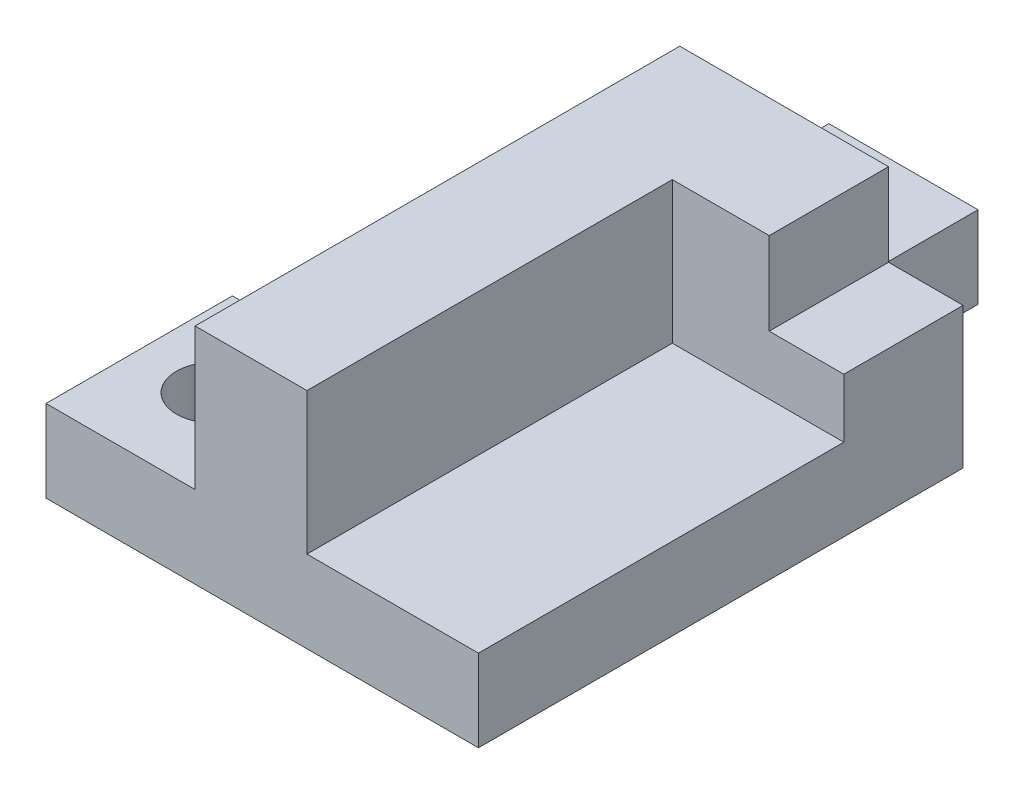
ISO-10303-21;
HEADER;
FILE_DESCRIPTION(('STEP AP214'),'2;1');
FILE_NAME('part.step','',(''),(''),'','','');
FILE_SCHEMA(('AUTOMOTIVE_DESIGN { 1 0 10303 214 1 1 1 1 }'));
ENDSEC;
DATA;
#1=APPLICATION_CONTEXT('core data for automotive mechanical design processes');
#2=APPLICATION_PROTOCOL_DEFINITION('international standard','automotive_design',2000,#1);
#3=PRODUCT_CONTEXT('',#1,'mechanical');
#4=PRODUCT('Part','Part','',(#3));
#5=PRODUCT_RELATED_PRODUCT_CATEGORY('part','',(#4));
#6=PRODUCT_DEFINITION_FORMATION('','',#4);
#7=PRODUCT_DEFINITION_CONTEXT('part definition',#1,'design');
#8=PRODUCT_DEFINITION('design','',#6,#7);
#9=PRODUCT_DEFINITION_SHAPE('','',#8);
#10=(LENGTH_UNIT() NAMED_UNIT(*) SI_UNIT(.MILLI.,.METRE.));
#11=(NAMED_UNIT(*) PLANE_ANGLE_UNIT() SI_UNIT($,.RADIAN.));
#12=(NAMED_UNIT(*) SI_UNIT($,.STERADIAN.) SOLID_ANGLE_UNIT());
#13=UNCERTAINTY_MEASURE_WITH_UNIT(LENGTH_MEASURE(1.E-05),#10,'distance_accuracy_value','');
#14=(GEOMETRIC_REPRESENTATION_CONTEXT(3) GLOBAL_UNCERTAINTY_ASSIGNED_CONTEXT((#13)) GLOBAL_UNIT_ASSIGNED_CONTEXT((#10,
#11,#12)) REPRESENTATION_CONTEXT('',''));
#15=CARTESIAN_POINT('',(0.,0.,0.));
#16=DIRECTION('',(0.,0.,1.));
#17=DIRECTION('',(1.,0.,0.));
#18=AXIS2_PLACEMENT_3D('',#15,#16,#17);
#19=CARTESIAN_POINT('',(-184.5,20.,-100.));
#20=DIRECTION('',(0.,0.,1.));
#21=DIRECTION('',(1.,0.,0.));
#22=AXIS2_PLACEMENT_3D('',#19,#20,#21);
#23=PLANE('',#22);
#24=DIRECTION('',(0.,-1.,0.));
#25=VECTOR('',#24,1.);
#26=CARTESIAN_POINT('',(-164.5,11.,-100.));
#27=LINE('',#26,#25);
#28=CARTESIAN_POINT('',(-164.5,11.,-100.));
#29=VERTEX_POINT('',#28);
#30=CARTESIAN_POINT('',(-164.5,0.,-100.));
#31=VERTEX_POINT('',#30);
#32=EDGE_CURVE('E164',#29,#31,#27,.T.);
#33=ORIENTED_EDGE('',*,*,#32,.F.);
#34=DIRECTION('',(1.,0.,0.));
#35=VECTOR('',#34,1.);
#36=CARTESIAN_POINT('',(-184.5,11.,-100.));
#37=LINE('',#36,#35);
#38=CARTESIAN_POINT('',(-184.5,11.,-100.));
#39=VERTEX_POINT('',#38);
#40=EDGE_CURVE('E54',#39,#29,#37,.T.);
#41=ORIENTED_EDGE('',*,*,#40,.F.);
#42=DIRECTION('',(0.,-1.,0.));
#43=VECTOR('',#42,1.);
#44=CARTESIAN_POINT('',(-184.5,20.,-100.));
#45=LINE('',#44,#43);
#46=CARTESIAN_POINT('',(-184.5,30.,-100.));
#47=VERTEX_POINT('',#46);
#48=EDGE_CURVE('E169',#47,#39,#45,.T.);
#49=ORIENTED_EDGE('',*,*,#48,.F.);
#50=DIRECTION('',(-1.,0.,0.));
#51=VECTOR('',#50,1.);
#52=CARTESIAN_POINT('',(-169.5,30.,-100.));
#53=LINE('',#52,#51);
#54=CARTESIAN_POINT('',(-156.5,30.,-100.));
#55=VERTEX_POINT('',#54);
#56=EDGE_CURVE('E238',#55,#47,#53,.T.);
#57=ORIENTED_EDGE('',*,*,#56,.F.);
#58=DIRECTION('',(0.,-1.,0.));
#59=VECTOR('',#58,1.);
#60=CARTESIAN_POINT('',(-156.5,20.,-100.));
#61=LINE('',#60,#59);
#62=CARTESIAN_POINT('',(-156.5,18.8949525573648,-100.));
#63=VERTEX_POINT('',#62);
#64=EDGE_CURVE('E213',#55,#63,#61,.T.);
#65=ORIENTED_EDGE('',*,*,#64,.T.);
#66=DIRECTION('',(1.,0.,0.));
#67=VECTOR('',#66,1.);
#68=CARTESIAN_POINT('',(-184.5,18.8949525573648,-100.));
#69=LINE('',#68,#67);
#70=CARTESIAN_POINT('',(-146.5,18.8949525573648,-100.));
#71=VERTEX_POINT('',#70);
#72=EDGE_CURVE('E207',#63,#71,#69,.T.);
#73=ORIENTED_EDGE('',*,*,#72,.T.);
#74=DIRECTION('',(0.,-1.,0.));
#75=VECTOR('',#74,1.);
#76=CARTESIAN_POINT('',(-146.5,20.,-100.));
#77=LINE('',#76,#75);
#78=CARTESIAN_POINT('',(-146.5,0.,-100.));
#79=VERTEX_POINT('',#78);
#80=EDGE_CURVE('E224',#71,#79,#77,.T.);
#81=ORIENTED_EDGE('',*,*,#80,.T.);
#82=DIRECTION('',(-1.,0.,0.));
#83=VECTOR('',#82,1.);
#84=CARTESIAN_POINT('',(-184.5,0.,-100.));
#85=LINE('',#84,#83);
#86=EDGE_CURVE('E60',#79,#31,#85,.T.);
#87=ORIENTED_EDGE('',*,*,#86,.T.);
#88=EDGE_LOOP('',(#33,#41,#49,#57,#65,#73,#81,#87));
#89=FACE_BOUND('',#88,.T.);
#90=ADVANCED_FACE('F39',(#89),#23,.F.);
#91=CARTESIAN_POINT('',(-184.5,20.,100.));
#92=DIRECTION('',(1.,0.,0.));
#93=DIRECTION('',(0.,0.,-1.));
#94=AXIS2_PLACEMENT_3D('',#91,#92,#93);
#95=PLANE('',#94);
#96=DIRECTION('',(0.,-1.,0.));
#97=VECTOR('',#96,1.);
#98=CARTESIAN_POINT('',(-184.5,0.,-60.));
#99=LINE('',#98,#97);
#100=CARTESIAN_POINT('',(-184.5,11.,-60.));
#101=VERTEX_POINT('',#100);
#102=CARTESIAN_POINT('',(-184.5,0.,-60.));
#103=VERTEX_POINT('',#102);
#104=EDGE_CURVE('E170',#101,#103,#99,.T.);
#105=ORIENTED_EDGE('',*,*,#104,.F.);
#106=DIRECTION('',(0.,0.,-1.));
#107=VECTOR('',#106,1.);
#108=CARTESIAN_POINT('',(-184.5,11.,0.));
#109=LINE('',#108,#107);
#110=CARTESIAN_POINT('',(-184.5,11.,-35.));
#111=VERTEX_POINT('',#110);
#112=EDGE_CURVE('E197',#111,#101,#109,.T.);
#113=ORIENTED_EDGE('',*,*,#112,.F.);
#114=DIRECTION('',(0.,-1.,0.));
#115=VECTOR('',#114,1.);
#116=CARTESIAN_POINT('',(-184.5,30.,-35.));
#117=LINE('',#116,#115);
#118=CARTESIAN_POINT('',(-184.5,30.,-35.));
#119=VERTEX_POINT('',#118);
#120=EDGE_CURVE('E231',#119,#111,#117,.T.);
#121=ORIENTED_EDGE('',*,*,#120,.F.);
#122=DIRECTION('',(0.,0.,1.));
#123=VECTOR('',#122,1.);
#124=CARTESIAN_POINT('',(-184.5,30.,-100.));
#125=LINE('',#124,#123);
#126=EDGE_CURVE('E247',#47,#119,#125,.T.);
#127=ORIENTED_EDGE('',*,*,#126,.F.);
#128=ORIENTED_EDGE('',*,*,#48,.T.);
#129=DIRECTION('',(0.,0.,1.));
#130=VECTOR('',#129,1.);
#131=CARTESIAN_POINT('',(-184.5,11.,-120.));
#132=LINE('',#131,#130);
#133=CARTESIAN_POINT('',(-184.5,11.,-120.));
#134=VERTEX_POINT('',#133);
#135=EDGE_CURVE('E150',#134,#39,#132,.T.);
#136=ORIENTED_EDGE('',*,*,#135,.F.);
#137=DIRECTION('',(0.,1.,0.));
#138=VECTOR('',#137,1.);
#139=CARTESIAN_POINT('',(-184.5,0.,-120.));
#140=LINE('',#139,#138);
#141=CARTESIAN_POINT('',(-184.5,0.,-120.));
#142=VERTEX_POINT('',#141);
#143=EDGE_CURVE('E156',#142,#134,#140,.T.);
#144=ORIENTED_EDGE('',*,*,#143,.F.);
#145=DIRECTION('',(0.,0.,1.));
#146=VECTOR('',#145,1.);
#147=CARTESIAN_POINT('',(-184.5,0.,100.));
#148=LINE('',#147,#146);
#149=EDGE_CURVE('E251',#142,#103,#148,.T.);
#150=ORIENTED_EDGE('',*,*,#149,.T.);
#151=EDGE_LOOP('',(#105,#113,#121,#127,#128,#136,#144,#150));
#152=FACE_BOUND('',#151,.T.);
#153=ADVANCED_FACE('F167',(#152),#95,.F.);
#154=CARTESIAN_POINT('',(-156.5,53.6124200983763,100.));
#155=DIRECTION('',(-1.,0.,0.));
#156=DIRECTION('',(0.,0.,1.));
#157=AXIS2_PLACEMENT_3D('',#154,#155,#156);
#158=PLANE('',#157);
#159=DIRECTION('',(0.,0.,-1.));
#160=VECTOR('',#159,1.);
#161=CARTESIAN_POINT('',(-156.5,18.8949525573648,100.));
#162=LINE('',#161,#160);
#163=CARTESIAN_POINT('',(-156.5,18.8949525573648,-84.));
#164=VERTEX_POINT('',#163);
#165=EDGE_CURVE('E203',#164,#63,#162,.T.);
#166=ORIENTED_EDGE('',*,*,#165,.T.);
#167=ORIENTED_EDGE('',*,*,#64,.F.);
#168=DIRECTION('',(0.,0.,1.));
#169=VECTOR('',#168,1.);
#170=CARTESIAN_POINT('',(-156.5,30.,0.));
#171=LINE('',#170,#169);
#172=CARTESIAN_POINT('',(-156.5,30.,-84.));
#173=VERTEX_POINT('',#172);
#174=EDGE_CURVE('E47',#55,#173,#171,.T.);
#175=ORIENTED_EDGE('',*,*,#174,.T.);
#176=DIRECTION('',(0.,1.,0.));
#177=VECTOR('',#176,1.);
#178=CARTESIAN_POINT('',(-156.5,30.,-84.));
#179=LINE('',#178,#177);
#180=EDGE_CURVE('E216',#164,#173,#179,.T.);
#181=ORIENTED_EDGE('',*,*,#180,.F.);
#182=EDGE_LOOP('',(#166,#167,#175,#181));
#183=FACE_BOUND('',#182,.T.);
#184=ADVANCED_FACE('F262',(#183),#158,.F.);
#185=CARTESIAN_POINT('',(0.,30.,0.));
#186=DIRECTION('',(0.,1.,0.));
#187=DIRECTION('',(0.,0.,1.));
#188=AXIS2_PLACEMENT_3D('',#185,#186,#187);
#189=PLANE('',#188);
#190=ORIENTED_EDGE('',*,*,#174,.F.);
#191=ORIENTED_EDGE('',*,*,#56,.T.);
#192=ORIENTED_EDGE('',*,*,#126,.T.);
#193=DIRECTION('',(1.,0.,0.));
#194=VECTOR('',#193,1.);
#195=CARTESIAN_POINT('',(-184.5,30.,-35.));
#196=LINE('',#195,#194);
#197=CARTESIAN_POINT('',(-169.5,30.,-35.));
#198=VERTEX_POINT('',#197);
#199=EDGE_CURVE('E245',#119,#198,#196,.T.);
#200=ORIENTED_EDGE('',*,*,#199,.T.);
#201=DIRECTION('',(0.,0.,-1.));
#202=VECTOR('',#201,1.);
#203=CARTESIAN_POINT('',(-169.5,30.,-84.));
#204=LINE('',#203,#202);
#205=CARTESIAN_POINT('',(-169.5,30.,-84.));
#206=VERTEX_POINT('',#205);
#207=EDGE_CURVE('E243',#198,#206,#204,.T.);
#208=ORIENTED_EDGE('',*,*,#207,.T.);
#209=DIRECTION('',(1.,0.,0.));
#210=VECTOR('',#209,1.);
#211=CARTESIAN_POINT('',(-169.5,30.,-84.));
#212=LINE('',#211,#210);
#213=EDGE_CURVE('E240',#206,#173,#212,.T.);
#214=ORIENTED_EDGE('',*,*,#213,.T.);
#215=EDGE_LOOP('',(#190,#191,#192,#200,#208,#214));
#216=FACE_BOUND('',#215,.T.);
#217=ADVANCED_FACE('F269',(#216),#189,.T.);
#218=CARTESIAN_POINT('',(-169.5,30.,-84.));
#219=DIRECTION('',(0.,0.,-1.));
#220=DIRECTION('',(-1.,0.,0.));
#221=AXIS2_PLACEMENT_3D('',#218,#219,#220);
#222=PLANE('',#221);
#223=DIRECTION('',(-1.,0.,0.));
#224=VECTOR('',#223,1.);
#225=CARTESIAN_POINT('',(-169.5,18.8949525573648,-84.));
#226=LINE('',#225,#224);
#227=CARTESIAN_POINT('',(-146.5,18.8949525573648,-84.));
#228=VERTEX_POINT('',#227);
#229=EDGE_CURVE('E210',#228,#164,#226,.T.);
#230=ORIENTED_EDGE('',*,*,#229,.T.);
#231=ORIENTED_EDGE('',*,*,#180,.T.);
#232=ORIENTED_EDGE('',*,*,#213,.F.);
#233=DIRECTION('',(0.,-1.,0.));
#234=VECTOR('',#233,1.);
#235=CARTESIAN_POINT('',(-169.5,30.,-84.));
#236=LINE('',#235,#234);
#237=CARTESIAN_POINT('',(-169.5,11.,-84.));
#238=VERTEX_POINT('',#237);
#239=EDGE_CURVE('E235',#206,#238,#236,.T.);
#240=ORIENTED_EDGE('',*,*,#239,.T.);
#241=DIRECTION('',(-1.,0.,0.));
#242=VECTOR('',#241,1.);
#243=CARTESIAN_POINT('',(-169.5,11.,-84.));
#244=LINE('',#243,#242);
#245=CARTESIAN_POINT('',(-146.5,11.,-84.));
#246=VERTEX_POINT('',#245);
#247=EDGE_CURVE('E229',#246,#238,#244,.T.);
#248=ORIENTED_EDGE('',*,*,#247,.F.);
#249=DIRECTION('',(0.,1.,0.));
#250=VECTOR('',#249,1.);
#251=CARTESIAN_POINT('',(-146.5,30.,-84.));
#252=LINE('',#251,#250);
#253=EDGE_CURVE('E219',#246,#228,#252,.T.);
#254=ORIENTED_EDGE('',*,*,#253,.T.);
#255=EDGE_LOOP('',(#230,#231,#232,#240,#248,#254));
#256=FACE_BOUND('',#255,.T.);
#257=ADVANCED_FACE('F268',(#256),#222,.F.);
#258=CARTESIAN_POINT('',(-119.5,18.8949525573648,100.));
#259=DIRECTION('',(0.,-1.,0.));
#260=DIRECTION('',(0.,0.,-1.));
#261=AXIS2_PLACEMENT_3D('',#258,#259,#260);
#262=PLANE('',#261);
#263=DIRECTION('',(0.,0.,1.));
#264=VECTOR('',#263,1.);
#265=CARTESIAN_POINT('',(-146.5,18.8949525573648,-161.504576805052));
#266=LINE('',#265,#264);
#267=EDGE_CURVE('E257',#71,#228,#266,.T.);
#268=ORIENTED_EDGE('',*,*,#267,.F.);
#269=ORIENTED_EDGE('',*,*,#72,.F.);
#270=ORIENTED_EDGE('',*,*,#165,.F.);
#271=ORIENTED_EDGE('',*,*,#229,.F.);
#272=EDGE_LOOP('',(#268,#269,#270,#271));
#273=FACE_BOUND('',#272,.T.);
#274=ADVANCED_FACE('F287',(#273),#262,.F.);
#275=CARTESIAN_POINT('',(-146.5,-39.,-161.504576805052));
#276=DIRECTION('',(-1.,0.,0.));
#277=DIRECTION('',(0.,0.,1.));
#278=AXIS2_PLACEMENT_3D('',#275,#276,#277);
#279=PLANE('',#278);
#280=DIRECTION('',(0.,0.,1.));
#281=VECTOR('',#280,1.);
#282=CARTESIAN_POINT('',(-146.5,11.,0.));
#283=LINE('',#282,#281);
#284=CARTESIAN_POINT('',(-146.5,11.,-35.));
#285=VERTEX_POINT('',#284);
#286=EDGE_CURVE('E254',#246,#285,#283,.T.);
#287=ORIENTED_EDGE('',*,*,#286,.T.);
#288=DIRECTION('',(0.,1.,0.));
#289=VECTOR('',#288,1.);
#290=CARTESIAN_POINT('',(-146.5,-190.,-35.));
#291=LINE('',#290,#289);
#292=CARTESIAN_POINT('',(-146.5,0.,-35.));
#293=VERTEX_POINT('',#292);
#294=EDGE_CURVE('E187',#293,#285,#291,.T.);
#295=ORIENTED_EDGE('',*,*,#294,.F.);
#296=DIRECTION('',(0.,0.,-1.));
#297=VECTOR('',#296,1.);
#298=CARTESIAN_POINT('',(-146.5,0.,0.));
#299=LINE('',#298,#297);
#300=EDGE_CURVE('E222',#293,#79,#299,.T.);
#301=ORIENTED_EDGE('',*,*,#300,.T.);
#302=ORIENTED_EDGE('',*,*,#80,.F.);
#303=ORIENTED_EDGE('',*,*,#267,.T.);
#304=ORIENTED_EDGE('',*,*,#253,.F.);
#305=EDGE_LOOP('',(#287,#295,#301,#302,#303,#304));
#306=FACE_BOUND('',#305,.T.);
#307=ADVANCED_FACE('F283',(#306),#279,.F.);
#308=CARTESIAN_POINT('',(0.,11.,0.));
#309=DIRECTION('',(0.,1.,0.));
#310=DIRECTION('',(0.,0.,1.));
#311=AXIS2_PLACEMENT_3D('',#308,#309,#310);
#312=PLANE('',#311);
#313=DIRECTION('',(-1.,0.,0.));
#314=VECTOR('',#313,1.);
#315=CARTESIAN_POINT('',(0.,11.,-35.));
#316=LINE('',#315,#314);
#317=CARTESIAN_POINT('',(-169.5,11.,-35.));
#318=VERTEX_POINT('',#317);
#319=EDGE_CURVE('E192',#285,#318,#316,.T.);
#320=ORIENTED_EDGE('',*,*,#319,.F.);
#321=ORIENTED_EDGE('',*,*,#286,.F.);
#322=ORIENTED_EDGE('',*,*,#247,.T.);
#323=DIRECTION('',(0.,0.,1.));
#324=VECTOR('',#323,1.);
#325=CARTESIAN_POINT('',(-169.5,11.,-84.));
#326=LINE('',#325,#324);
#327=EDGE_CURVE('E226',#238,#318,#326,.T.);
#328=ORIENTED_EDGE('',*,*,#327,.T.);
#329=EDGE_LOOP('',(#320,#321,#322,#328));
#330=FACE_BOUND('',#329,.T.);
#331=ADVANCED_FACE('F280',(#330),#312,.T.);
#332=CARTESIAN_POINT('',(-169.5,30.,84.));
#333=DIRECTION('',(-1.,0.,0.));
#334=DIRECTION('',(0.,0.,1.));
#335=AXIS2_PLACEMENT_3D('',#332,#333,#334);
#336=PLANE('',#335);
#337=DIRECTION('',(0.,-1.,0.));
#338=VECTOR('',#337,1.);
#339=CARTESIAN_POINT('',(-169.5,30.,-35.));
#340=LINE('',#339,#338);
#341=EDGE_CURVE('E233',#198,#318,#340,.T.);
#342=ORIENTED_EDGE('',*,*,#341,.T.);
#343=ORIENTED_EDGE('',*,*,#327,.F.);
#344=ORIENTED_EDGE('',*,*,#239,.F.);
#345=ORIENTED_EDGE('',*,*,#207,.F.);
#346=EDGE_LOOP('',(#342,#343,#344,#345));
#347=FACE_BOUND('',#346,.T.);
#348=ADVANCED_FACE('F275',(#347),#336,.F.);
#349=CARTESIAN_POINT('',(-204.5,0.,0.));
#350=DIRECTION('',(-1.,0.,0.));
#351=DIRECTION('',(0.,0.,1.));
#352=AXIS2_PLACEMENT_3D('',#349,#350,#351);
#353=PLANE('',#352);
#354=DIRECTION('',(0.,-1.,0.));
#355=VECTOR('',#354,1.);
#356=CARTESIAN_POINT('',(-204.5,0.,-35.));
#357=LINE('',#356,#355);
#358=CARTESIAN_POINT('',(-204.5,11.,-35.));
#359=VERTEX_POINT('',#358);
#360=CARTESIAN_POINT('',(-204.5,0.,-35.));
#361=VERTEX_POINT('',#360);
#362=EDGE_CURVE('E11',#359,#361,#357,.T.);
#363=ORIENTED_EDGE('',*,*,#362,.F.);
#364=DIRECTION('',(0.,0.,-1.));
#365=VECTOR('',#364,1.);
#366=CARTESIAN_POINT('',(-204.5,11.,0.));
#367=LINE('',#366,#365);
#368=CARTESIAN_POINT('',(-204.5,11.,-60.));
#369=VERTEX_POINT('',#368);
#370=EDGE_CURVE('E198',#359,#369,#367,.T.);
#371=ORIENTED_EDGE('',*,*,#370,.T.);
#372=DIRECTION('',(0.,1.,0.));
#373=VECTOR('',#372,1.);
#374=CARTESIAN_POINT('',(-204.5,11.,-60.));
#375=LINE('',#374,#373);
#376=CARTESIAN_POINT('',(-204.5,0.,-60.));
#377=VERTEX_POINT('',#376);
#378=EDGE_CURVE('E181',#377,#369,#375,.T.);
#379=ORIENTED_EDGE('',*,*,#378,.F.);
#380=DIRECTION('',(0.,0.,1.));
#381=VECTOR('',#380,1.);
#382=CARTESIAN_POINT('',(-204.5,0.,0.));
#383=LINE('',#382,#381);
#384=EDGE_CURVE('E200',#377,#361,#383,.T.);
#385=ORIENTED_EDGE('',*,*,#384,.T.);
#386=EDGE_LOOP('',(#363,#371,#379,#385));
#387=FACE_BOUND('',#386,.T.);
#388=ADVANCED_FACE('F299',(#387),#353,.T.);
#389=CARTESIAN_POINT('',(-204.5,11.,0.));
#390=DIRECTION('',(0.,-1.,0.));
#391=DIRECTION('',(0.,0.,-1.));
#392=AXIS2_PLACEMENT_3D('',#389,#390,#391);
#393=PLANE('',#392);
#394=CARTESIAN_POINT('',(-194.5,11.,-47.5));
#395=DIRECTION('',(0.,1.,0.));
#396=DIRECTION('',(0.,0.,1.));
#397=AXIS2_PLACEMENT_3D('',#394,#395,#396);
#398=CIRCLE('',#397,4.99999999999999);
#399=CARTESIAN_POINT('',(-194.5,11.,-42.5));
#400=VERTEX_POINT('',#399);
#401=EDGE_CURVE('E317',#400,#400,#398,.T.);
#402=ORIENTED_EDGE('',*,*,#401,.F.);
#403=EDGE_LOOP('',(#402));
#404=FACE_BOUND('',#403,.T.);
#405=ORIENTED_EDGE('',*,*,#370,.F.);
#406=DIRECTION('',(1.,0.,0.));
#407=VECTOR('',#406,1.);
#408=CARTESIAN_POINT('',(-204.5,11.,-35.));
#409=LINE('',#408,#407);
#410=EDGE_CURVE('E189',#359,#111,#409,.T.);
#411=ORIENTED_EDGE('',*,*,#410,.T.);
#412=ORIENTED_EDGE('',*,*,#112,.T.);
#413=DIRECTION('',(1.,0.,0.));
#414=VECTOR('',#413,1.);
#415=CARTESIAN_POINT('',(-184.5,11.,-60.));
#416=LINE('',#415,#414);
#417=EDGE_CURVE('E184',#369,#101,#416,.T.);
#418=ORIENTED_EDGE('',*,*,#417,.F.);
#419=EDGE_LOOP('',(#405,#411,#412,#418));
#420=FACE_BOUND('',#419,.T.);
#421=ADVANCED_FACE('F295',(#404,#420),#393,.F.);
#422=CARTESIAN_POINT('',(0.,0.,0.));
#423=DIRECTION('',(0.,-1.,0.));
#424=DIRECTION('',(0.,0.,-1.));
#425=AXIS2_PLACEMENT_3D('',#422,#423,#424);
#426=PLANE('',#425);
#427=CARTESIAN_POINT('',(-174.5,0.,-110.));
#428=DIRECTION('',(0.,-1.,0.));
#429=DIRECTION('',(0.,0.,-1.));
#430=AXIS2_PLACEMENT_3D('',#427,#428,#429);
#431=CIRCLE('',#430,5.00000000000002);
#432=CARTESIAN_POINT('',(-174.5,0.,-115.));
#433=VERTEX_POINT('',#432);
#434=EDGE_CURVE('E314',#433,#433,#431,.T.);
#435=ORIENTED_EDGE('',*,*,#434,.F.);
#436=EDGE_LOOP('',(#435));
#437=FACE_BOUND('',#436,.T.);
#438=CARTESIAN_POINT('',(-194.5,0.,-47.5));
#439=DIRECTION('',(0.,-1.,0.));
#440=DIRECTION('',(0.,0.,-1.));
#441=AXIS2_PLACEMENT_3D('',#438,#439,#440);
#442=CIRCLE('',#441,4.99999999999999);
#443=CARTESIAN_POINT('',(-194.5,0.,-52.5));
#444=VERTEX_POINT('',#443);
#445=EDGE_CURVE('E42',#444,#444,#442,.T.);
#446=ORIENTED_EDGE('',*,*,#445,.F.);
#447=EDGE_LOOP('',(#446));
#448=FACE_BOUND('',#447,.T.);
#449=DIRECTION('',(1.,0.,0.));
#450=VECTOR('',#449,1.);
#451=CARTESIAN_POINT('',(0.,0.,-35.));
#452=LINE('',#451,#450);
#453=EDGE_CURVE('E195',#361,#293,#452,.T.);
#454=ORIENTED_EDGE('',*,*,#453,.F.);
#455=ORIENTED_EDGE('',*,*,#384,.F.);
#456=DIRECTION('',(-1.,0.,0.));
#457=VECTOR('',#456,1.);
#458=CARTESIAN_POINT('',(-204.5,0.,-60.));
#459=LINE('',#458,#457);
#460=EDGE_CURVE('E173',#103,#377,#459,.T.);
#461=ORIENTED_EDGE('',*,*,#460,.F.);
#462=ORIENTED_EDGE('',*,*,#149,.F.);
#463=DIRECTION('',(-1.,0.,0.));
#464=VECTOR('',#463,1.);
#465=CARTESIAN_POINT('',(-164.5,0.,-120.));
#466=LINE('',#465,#464);
#467=CARTESIAN_POINT('',(-164.5,0.,-120.));
#468=VERTEX_POINT('',#467);
#469=EDGE_CURVE('E162',#468,#142,#466,.T.);
#470=ORIENTED_EDGE('',*,*,#469,.F.);
#471=DIRECTION('',(0.,0.,1.));
#472=VECTOR('',#471,1.);
#473=CARTESIAN_POINT('',(-164.5,0.,-120.));
#474=LINE('',#473,#472);
#475=EDGE_CURVE('E175',#468,#31,#474,.T.);
#476=ORIENTED_EDGE('',*,*,#475,.T.);
#477=ORIENTED_EDGE('',*,*,#86,.F.);
#478=ORIENTED_EDGE('',*,*,#300,.F.);
#479=EDGE_LOOP('',(#454,#455,#461,#462,#470,#476,#477,#478));
#480=FACE_BOUND('',#479,.T.);
#481=ADVANCED_FACE('F305',(#437,#448,#480),#426,.T.);
#482=CARTESIAN_POINT('',(-184.5,30.,-35.));
#483=DIRECTION('',(0.,0.,-1.));
#484=DIRECTION('',(-1.,0.,0.));
#485=AXIS2_PLACEMENT_3D('',#482,#483,#484);
#486=PLANE('',#485);
#487=ORIENTED_EDGE('',*,*,#120,.T.);
#488=ORIENTED_EDGE('',*,*,#410,.F.);
#489=ORIENTED_EDGE('',*,*,#362,.T.);
#490=ORIENTED_EDGE('',*,*,#453,.T.);
#491=ORIENTED_EDGE('',*,*,#294,.T.);
#492=ORIENTED_EDGE('',*,*,#319,.T.);
#493=ORIENTED_EDGE('',*,*,#341,.F.);
#494=ORIENTED_EDGE('',*,*,#199,.F.);
#495=EDGE_LOOP('',(#487,#488,#489,#490,#491,#492,#493,#494));
#496=FACE_BOUND('',#495,.T.);
#497=ADVANCED_FACE('F291',(#496),#486,.F.);
#498=CARTESIAN_POINT('',(0.,0.,-60.));
#499=DIRECTION('',(0.,0.,1.));
#500=DIRECTION('',(1.,0.,0.));
#501=AXIS2_PLACEMENT_3D('',#498,#499,#500);
#502=PLANE('',#501);
#503=ORIENTED_EDGE('',*,*,#104,.T.);
#504=ORIENTED_EDGE('',*,*,#460,.T.);
#505=ORIENTED_EDGE('',*,*,#378,.T.);
#506=ORIENTED_EDGE('',*,*,#417,.T.);
#507=EDGE_LOOP('',(#503,#504,#505,#506));
#508=FACE_BOUND('',#507,.T.);
#509=ADVANCED_FACE('F301',(#508),#502,.F.);
#510=CARTESIAN_POINT('',(-184.5,11.,-120.));
#511=DIRECTION('',(0.,-1.,0.));
#512=DIRECTION('',(0.,0.,-1.));
#513=AXIS2_PLACEMENT_3D('',#510,#511,#512);
#514=PLANE('',#513);
#515=CARTESIAN_POINT('',(-174.5,11.,-110.));
#516=DIRECTION('',(0.,1.,0.));
#517=DIRECTION('',(0.,0.,1.));
#518=AXIS2_PLACEMENT_3D('',#515,#516,#517);
#519=CIRCLE('',#518,5.00000000000002);
#520=CARTESIAN_POINT('',(-174.5,11.,-105.));
#521=VERTEX_POINT('',#520);
#522=EDGE_CURVE('E320',#521,#521,#519,.T.);
#523=ORIENTED_EDGE('',*,*,#522,.F.);
#524=EDGE_LOOP('',(#523));
#525=FACE_BOUND('',#524,.T.);
#526=ORIENTED_EDGE('',*,*,#40,.T.);
#527=DIRECTION('',(0.,0.,1.));
#528=VECTOR('',#527,1.);
#529=CARTESIAN_POINT('',(-164.5,11.,-120.));
#530=LINE('',#529,#528);
#531=CARTESIAN_POINT('',(-164.5,11.,-120.));
#532=VERTEX_POINT('',#531);
#533=EDGE_CURVE('E152',#532,#29,#530,.T.);
#534=ORIENTED_EDGE('',*,*,#533,.F.);
#535=DIRECTION('',(1.,0.,0.));
#536=VECTOR('',#535,1.);
#537=CARTESIAN_POINT('',(-184.5,11.,-120.));
#538=LINE('',#537,#536);
#539=EDGE_CURVE('E146',#134,#532,#538,.T.);
#540=ORIENTED_EDGE('',*,*,#539,.F.);
#541=ORIENTED_EDGE('',*,*,#135,.T.);
#542=EDGE_LOOP('',(#526,#534,#540,#541));
#543=FACE_BOUND('',#542,.T.);
#544=ADVANCED_FACE('F148',(#525,#543),#514,.F.);
#545=CARTESIAN_POINT('',(-164.5,11.,-120.));
#546=DIRECTION('',(-1.,0.,0.));
#547=DIRECTION('',(0.,0.,1.));
#548=AXIS2_PLACEMENT_3D('',#545,#546,#547);
#549=PLANE('',#548);
#550=ORIENTED_EDGE('',*,*,#32,.T.);
#551=ORIENTED_EDGE('',*,*,#475,.F.);
#552=DIRECTION('',(0.,-1.,0.));
#553=VECTOR('',#552,1.);
#554=CARTESIAN_POINT('',(-164.5,11.,-120.));
#555=LINE('',#554,#553);
#556=EDGE_CURVE('E155',#532,#468,#555,.T.);
#557=ORIENTED_EDGE('',*,*,#556,.F.);
#558=ORIENTED_EDGE('',*,*,#533,.T.);
#559=EDGE_LOOP('',(#550,#551,#557,#558));
#560=FACE_BOUND('',#559,.T.);
#561=ADVANCED_FACE('F327',(#560),#549,.F.);
#562=CARTESIAN_POINT('',(0.,0.,-120.));
#563=DIRECTION('',(0.,0.,-1.));
#564=DIRECTION('',(-1.,0.,0.));
#565=AXIS2_PLACEMENT_3D('',#562,#563,#564);
#566=PLANE('',#565);
#567=ORIENTED_EDGE('',*,*,#143,.T.);
#568=ORIENTED_EDGE('',*,*,#539,.T.);
#569=ORIENTED_EDGE('',*,*,#556,.T.);
#570=ORIENTED_EDGE('',*,*,#469,.T.);
#571=EDGE_LOOP('',(#567,#568,#569,#570));
#572=FACE_BOUND('',#571,.T.);
#573=ADVANCED_FACE('F160',(#572),#566,.T.);
#574=CARTESIAN_POINT('',(-174.5,-37.,-110.));
#575=DIRECTION('',(0.,1.,0.));
#576=DIRECTION('',(0.,0.,1.));
#577=AXIS2_PLACEMENT_3D('',#574,#575,#576);
#578=CYLINDRICAL_SURFACE('',#577,5.00000000000002);
#579=ORIENTED_EDGE('',*,*,#434,.T.);
#580=EDGE_LOOP('',(#579));
#581=FACE_BOUND('',#580,.T.);
#582=ORIENTED_EDGE('',*,*,#522,.T.);
#583=EDGE_LOOP('',(#582));
#584=FACE_BOUND('',#583,.T.);
#585=ADVANCED_FACE('F324',(#581,#584),#578,.F.);
#586=CARTESIAN_POINT('',(-194.5,-37.,-47.5));
#587=DIRECTION('',(0.,1.,0.));
#588=DIRECTION('',(0.,0.,1.));
#589=AXIS2_PLACEMENT_3D('',#586,#587,#588);
#590=CYLINDRICAL_SURFACE('',#589,4.99999999999999);
#591=ORIENTED_EDGE('',*,*,#445,.T.);
#592=EDGE_LOOP('',(#591));
#593=FACE_BOUND('',#592,.T.);
#594=ORIENTED_EDGE('',*,*,#401,.T.);
#595=EDGE_LOOP('',(#594));
#596=FACE_BOUND('',#595,.T.);
#597=ADVANCED_FACE('F429',(#593,#596),#590,.F.);
#598=CLOSED_SHELL('',(#90,#153,#184,#217,#257,#274,#307,#331,#348,#388,#421,#481,#497,#509,#544,
#561,#573,#585,#597));
#599=MANIFOLD_SOLID_BREP('B2',#598);
#600=ADVANCED_BREP_SHAPE_REPRESENTATION('',(#18,#599),#14);
#601=SHAPE_DEFINITION_REPRESENTATION(#9,#600);
ENDSEC;
END-ISO-10303-21;
